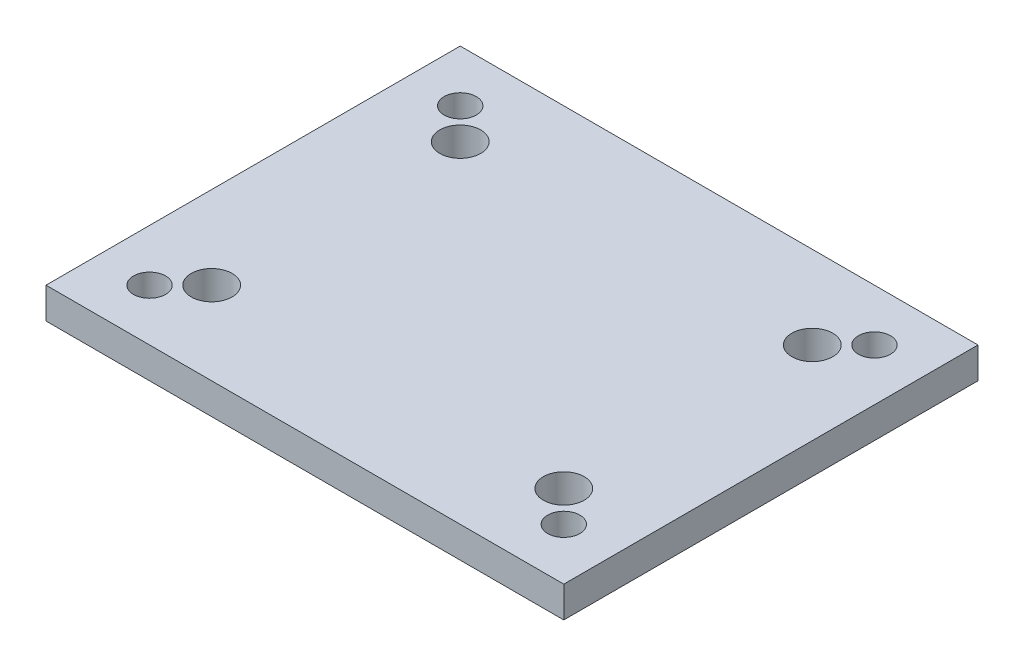
ISO-10303-21;
HEADER;
FILE_DESCRIPTION(('STEP AP214'),'2;1');
FILE_NAME('part.step','',(''),(''),'','','');
FILE_SCHEMA(('AUTOMOTIVE_DESIGN { 1 0 10303 214 1 1 1 1 }'));
ENDSEC;
DATA;
#1=APPLICATION_CONTEXT('core data for automotive mechanical design processes');
#2=APPLICATION_PROTOCOL_DEFINITION('international standard','automotive_design',2000,#1);
#3=PRODUCT_CONTEXT('',#1,'mechanical');
#4=PRODUCT('Part','Part','',(#3));
#5=PRODUCT_RELATED_PRODUCT_CATEGORY('part','',(#4));
#6=PRODUCT_DEFINITION_FORMATION('','',#4);
#7=PRODUCT_DEFINITION_CONTEXT('part definition',#1,'design');
#8=PRODUCT_DEFINITION('design','',#6,#7);
#9=PRODUCT_DEFINITION_SHAPE('','',#8);
#10=(LENGTH_UNIT() NAMED_UNIT(*) SI_UNIT(.MILLI.,.METRE.));
#11=(NAMED_UNIT(*) PLANE_ANGLE_UNIT() SI_UNIT($,.RADIAN.));
#12=(NAMED_UNIT(*) SI_UNIT($,.STERADIAN.) SOLID_ANGLE_UNIT());
#13=UNCERTAINTY_MEASURE_WITH_UNIT(LENGTH_MEASURE(1.E-05),#10,'distance_accuracy_value','');
#14=(GEOMETRIC_REPRESENTATION_CONTEXT(3) GLOBAL_UNCERTAINTY_ASSIGNED_CONTEXT((#13)) GLOBAL_UNIT_ASSIGNED_CONTEXT((#10,
#11,#12)) REPRESENTATION_CONTEXT('',''));
#15=CARTESIAN_POINT('',(0.,0.,0.));
#16=DIRECTION('',(0.,0.,1.));
#17=DIRECTION('',(1.,0.,0.));
#18=AXIS2_PLACEMENT_3D('',#15,#16,#17);
#19=CARTESIAN_POINT('',(0.,3.,0.));
#20=DIRECTION('',(0.,-1.,0.));
#21=DIRECTION('',(0.,0.,-1.));
#22=AXIS2_PLACEMENT_3D('',#19,#20,#21);
#23=PLANE('',#22);
#24=DIRECTION('',(0.,0.,1.));
#25=VECTOR('',#24,1.);
#26=CARTESIAN_POINT('',(0.,3.,0.));
#27=LINE('',#26,#25);
#28=CARTESIAN_POINT('',(0.,3.,-40.));
#29=VERTEX_POINT('',#28);
#30=CARTESIAN_POINT('',(0.,3.,0.));
#31=VERTEX_POINT('',#30);
#32=EDGE_CURVE('E96',#29,#31,#27,.T.);
#33=ORIENTED_EDGE('',*,*,#32,.T.);
#34=DIRECTION('',(1.,0.,0.));
#35=VECTOR('',#34,1.);
#36=CARTESIAN_POINT('',(0.,3.,0.));
#37=LINE('',#36,#35);
#38=CARTESIAN_POINT('',(50.,3.,0.));
#39=VERTEX_POINT('',#38);
#40=EDGE_CURVE('E91',#31,#39,#37,.T.);
#41=ORIENTED_EDGE('',*,*,#40,.T.);
#42=DIRECTION('',(0.,0.,-1.));
#43=VECTOR('',#42,1.);
#44=CARTESIAN_POINT('',(50.,3.,0.));
#45=LINE('',#44,#43);
#46=CARTESIAN_POINT('',(50.,3.,-40.));
#47=VERTEX_POINT('',#46);
#48=EDGE_CURVE('E94',#39,#47,#45,.T.);
#49=ORIENTED_EDGE('',*,*,#48,.T.);
#50=DIRECTION('',(-1.,0.,0.));
#51=VECTOR('',#50,1.);
#52=CARTESIAN_POINT('',(0.,3.,-40.));
#53=LINE('',#52,#51);
#54=EDGE_CURVE('E61',#47,#29,#53,.T.);
#55=ORIENTED_EDGE('',*,*,#54,.T.);
#56=EDGE_LOOP('',(#33,#41,#49,#55));
#57=FACE_BOUND('',#56,.T.);
#58=CARTESIAN_POINT('',(5.,3.,-35.));
#59=DIRECTION('',(0.,1.,0.));
#60=DIRECTION('',(0.,0.,1.));
#61=AXIS2_PLACEMENT_3D('',#58,#59,#60);
#62=CIRCLE('',#61,1.55);
#63=CARTESIAN_POINT('',(5.,3.,-33.45));
#64=VERTEX_POINT('',#63);
#65=EDGE_CURVE('E116',#64,#64,#62,.T.);
#66=ORIENTED_EDGE('',*,*,#65,.F.);
#67=EDGE_LOOP('',(#66));
#68=FACE_BOUND('',#67,.T.);
#69=CARTESIAN_POINT('',(45.,3.,-35.));
#70=DIRECTION('',(0.,1.,0.));
#71=DIRECTION('',(0.,0.,1.));
#72=AXIS2_PLACEMENT_3D('',#69,#70,#71);
#73=CIRCLE('',#72,1.55);
#74=CARTESIAN_POINT('',(45.,3.,-33.45));
#75=VERTEX_POINT('',#74);
#76=EDGE_CURVE('E138',#75,#75,#73,.T.);
#77=ORIENTED_EDGE('',*,*,#76,.F.);
#78=EDGE_LOOP('',(#77));
#79=FACE_BOUND('',#78,.T.);
#80=CARTESIAN_POINT('',(5.,3.,-5.));
#81=DIRECTION('',(0.,1.,0.));
#82=DIRECTION('',(0.,0.,1.));
#83=AXIS2_PLACEMENT_3D('',#80,#81,#82);
#84=CIRCLE('',#83,1.55);
#85=CARTESIAN_POINT('',(5.,3.,-3.45));
#86=VERTEX_POINT('',#85);
#87=EDGE_CURVE('E146',#86,#86,#84,.T.);
#88=ORIENTED_EDGE('',*,*,#87,.F.);
#89=EDGE_LOOP('',(#88));
#90=FACE_BOUND('',#89,.T.);
#91=CARTESIAN_POINT('',(45.,3.,-5.));
#92=DIRECTION('',(0.,1.,0.));
#93=DIRECTION('',(0.,0.,1.));
#94=AXIS2_PLACEMENT_3D('',#91,#92,#93);
#95=CIRCLE('',#94,1.55);
#96=CARTESIAN_POINT('',(45.,3.,-3.45));
#97=VERTEX_POINT('',#96);
#98=EDGE_CURVE('E154',#97,#97,#95,.T.);
#99=ORIENTED_EDGE('',*,*,#98,.F.);
#100=EDGE_LOOP('',(#99));
#101=FACE_BOUND('',#100,.T.);
#102=CARTESIAN_POINT('',(42.,3.,-32.));
#103=DIRECTION('',(0.,1.,0.));
#104=DIRECTION('',(0.,0.,1.));
#105=AXIS2_PLACEMENT_3D('',#102,#103,#104);
#106=CIRCLE('',#105,1.975);
#107=CARTESIAN_POINT('',(42.,3.,-30.025));
#108=VERTEX_POINT('',#107);
#109=EDGE_CURVE('E162',#108,#108,#106,.T.);
#110=ORIENTED_EDGE('',*,*,#109,.F.);
#111=EDGE_LOOP('',(#110));
#112=FACE_BOUND('',#111,.T.);
#113=CARTESIAN_POINT('',(8.,3.,-32.));
#114=DIRECTION('',(0.,1.,0.));
#115=DIRECTION('',(0.,0.,1.));
#116=AXIS2_PLACEMENT_3D('',#113,#114,#115);
#117=CIRCLE('',#116,1.975);
#118=CARTESIAN_POINT('',(8.,3.,-30.025));
#119=VERTEX_POINT('',#118);
#120=EDGE_CURVE('E170',#119,#119,#117,.T.);
#121=ORIENTED_EDGE('',*,*,#120,.F.);
#122=EDGE_LOOP('',(#121));
#123=FACE_BOUND('',#122,.T.);
#124=CARTESIAN_POINT('',(8.,3.,-8.));
#125=DIRECTION('',(0.,1.,0.));
#126=DIRECTION('',(0.,0.,1.));
#127=AXIS2_PLACEMENT_3D('',#124,#125,#126);
#128=CIRCLE('',#127,1.975);
#129=CARTESIAN_POINT('',(8.,3.,-6.025));
#130=VERTEX_POINT('',#129);
#131=EDGE_CURVE('E178',#130,#130,#128,.T.);
#132=ORIENTED_EDGE('',*,*,#131,.F.);
#133=EDGE_LOOP('',(#132));
#134=FACE_BOUND('',#133,.T.);
#135=CARTESIAN_POINT('',(42.,3.,-8.));
#136=DIRECTION('',(0.,1.,0.));
#137=DIRECTION('',(0.,0.,1.));
#138=AXIS2_PLACEMENT_3D('',#135,#136,#137);
#139=CIRCLE('',#138,1.975);
#140=CARTESIAN_POINT('',(42.,3.,-6.025));
#141=VERTEX_POINT('',#140);
#142=EDGE_CURVE('E186',#141,#141,#139,.T.);
#143=ORIENTED_EDGE('',*,*,#142,.F.);
#144=EDGE_LOOP('',(#143));
#145=FACE_BOUND('',#144,.T.);
#146=ADVANCED_FACE('F43',(#57,#68,#79,#90,#101,#112,#123,#134,#145),#23,.F.);
#147=CARTESIAN_POINT('',(0.,0.,0.));
#148=DIRECTION('',(0.,-1.,0.));
#149=DIRECTION('',(0.,0.,-1.));
#150=AXIS2_PLACEMENT_3D('',#147,#148,#149);
#151=PLANE('',#150);
#152=CARTESIAN_POINT('',(8.,0.,-8.));
#153=DIRECTION('',(0.,1.,0.));
#154=DIRECTION('',(0.,0.,1.));
#155=AXIS2_PLACEMENT_3D('',#152,#153,#154);
#156=CIRCLE('',#155,1.975);
#157=CARTESIAN_POINT('',(8.,0.,-6.025));
#158=VERTEX_POINT('',#157);
#159=EDGE_CURVE('E182',#158,#158,#156,.T.);
#160=ORIENTED_EDGE('',*,*,#159,.T.);
#161=EDGE_LOOP('',(#160));
#162=FACE_BOUND('',#161,.T.);
#163=CARTESIAN_POINT('',(42.,0.,-32.));
#164=DIRECTION('',(0.,1.,0.));
#165=DIRECTION('',(0.,0.,1.));
#166=AXIS2_PLACEMENT_3D('',#163,#164,#165);
#167=CIRCLE('',#166,1.975);
#168=CARTESIAN_POINT('',(42.,0.,-30.025));
#169=VERTEX_POINT('',#168);
#170=EDGE_CURVE('E166',#169,#169,#167,.T.);
#171=ORIENTED_EDGE('',*,*,#170,.T.);
#172=EDGE_LOOP('',(#171));
#173=FACE_BOUND('',#172,.T.);
#174=CARTESIAN_POINT('',(5.,0.,-5.));
#175=DIRECTION('',(0.,1.,0.));
#176=DIRECTION('',(0.,0.,1.));
#177=AXIS2_PLACEMENT_3D('',#174,#175,#176);
#178=CIRCLE('',#177,1.55);
#179=CARTESIAN_POINT('',(5.,0.,-3.45));
#180=VERTEX_POINT('',#179);
#181=EDGE_CURVE('E150',#180,#180,#178,.T.);
#182=ORIENTED_EDGE('',*,*,#181,.T.);
#183=EDGE_LOOP('',(#182));
#184=FACE_BOUND('',#183,.T.);
#185=CARTESIAN_POINT('',(5.,0.,-35.));
#186=DIRECTION('',(0.,1.,0.));
#187=DIRECTION('',(0.,0.,1.));
#188=AXIS2_PLACEMENT_3D('',#185,#186,#187);
#189=CIRCLE('',#188,1.55);
#190=CARTESIAN_POINT('',(5.,0.,-33.45));
#191=VERTEX_POINT('',#190);
#192=EDGE_CURVE('E134',#191,#191,#189,.T.);
#193=ORIENTED_EDGE('',*,*,#192,.T.);
#194=EDGE_LOOP('',(#193));
#195=FACE_BOUND('',#194,.T.);
#196=DIRECTION('',(0.,0.,1.));
#197=VECTOR('',#196,1.);
#198=CARTESIAN_POINT('',(0.,0.,0.));
#199=LINE('',#198,#197);
#200=CARTESIAN_POINT('',(0.,0.,-40.));
#201=VERTEX_POINT('',#200);
#202=CARTESIAN_POINT('',(0.,0.,0.));
#203=VERTEX_POINT('',#202);
#204=EDGE_CURVE('E112',#201,#203,#199,.T.);
#205=ORIENTED_EDGE('',*,*,#204,.F.);
#206=DIRECTION('',(-1.,0.,0.));
#207=VECTOR('',#206,1.);
#208=CARTESIAN_POINT('',(0.,0.,-40.));
#209=LINE('',#208,#207);
#210=CARTESIAN_POINT('',(50.,0.,-40.));
#211=VERTEX_POINT('',#210);
#212=EDGE_CURVE('E84',#211,#201,#209,.T.);
#213=ORIENTED_EDGE('',*,*,#212,.F.);
#214=DIRECTION('',(0.,0.,-1.));
#215=VECTOR('',#214,1.);
#216=CARTESIAN_POINT('',(50.,0.,0.));
#217=LINE('',#216,#215);
#218=CARTESIAN_POINT('',(50.,0.,0.));
#219=VERTEX_POINT('',#218);
#220=EDGE_CURVE('E78',#219,#211,#217,.T.);
#221=ORIENTED_EDGE('',*,*,#220,.F.);
#222=DIRECTION('',(1.,0.,0.));
#223=VECTOR('',#222,1.);
#224=CARTESIAN_POINT('',(0.,0.,0.));
#225=LINE('',#224,#223);
#226=EDGE_CURVE('E101',#203,#219,#225,.T.);
#227=ORIENTED_EDGE('',*,*,#226,.F.);
#228=EDGE_LOOP('',(#205,#213,#221,#227));
#229=FACE_BOUND('',#228,.T.);
#230=CARTESIAN_POINT('',(45.,0.,-35.));
#231=DIRECTION('',(0.,1.,0.));
#232=DIRECTION('',(0.,0.,1.));
#233=AXIS2_PLACEMENT_3D('',#230,#231,#232);
#234=CIRCLE('',#233,1.55);
#235=CARTESIAN_POINT('',(45.,0.,-33.45));
#236=VERTEX_POINT('',#235);
#237=EDGE_CURVE('E142',#236,#236,#234,.T.);
#238=ORIENTED_EDGE('',*,*,#237,.T.);
#239=EDGE_LOOP('',(#238));
#240=FACE_BOUND('',#239,.T.);
#241=CARTESIAN_POINT('',(45.,0.,-5.));
#242=DIRECTION('',(0.,1.,0.));
#243=DIRECTION('',(0.,0.,1.));
#244=AXIS2_PLACEMENT_3D('',#241,#242,#243);
#245=CIRCLE('',#244,1.55);
#246=CARTESIAN_POINT('',(45.,0.,-3.45));
#247=VERTEX_POINT('',#246);
#248=EDGE_CURVE('E158',#247,#247,#245,.T.);
#249=ORIENTED_EDGE('',*,*,#248,.T.);
#250=EDGE_LOOP('',(#249));
#251=FACE_BOUND('',#250,.T.);
#252=CARTESIAN_POINT('',(8.,0.,-32.));
#253=DIRECTION('',(0.,1.,0.));
#254=DIRECTION('',(0.,0.,1.));
#255=AXIS2_PLACEMENT_3D('',#252,#253,#254);
#256=CIRCLE('',#255,1.975);
#257=CARTESIAN_POINT('',(8.,0.,-30.025));
#258=VERTEX_POINT('',#257);
#259=EDGE_CURVE('E174',#258,#258,#256,.T.);
#260=ORIENTED_EDGE('',*,*,#259,.T.);
#261=EDGE_LOOP('',(#260));
#262=FACE_BOUND('',#261,.T.);
#263=CARTESIAN_POINT('',(42.,0.,-8.));
#264=DIRECTION('',(0.,1.,0.));
#265=DIRECTION('',(0.,0.,1.));
#266=AXIS2_PLACEMENT_3D('',#263,#264,#265);
#267=CIRCLE('',#266,1.975);
#268=CARTESIAN_POINT('',(42.,0.,-6.025));
#269=VERTEX_POINT('',#268);
#270=EDGE_CURVE('E190',#269,#269,#267,.T.);
#271=ORIENTED_EDGE('',*,*,#270,.T.);
#272=EDGE_LOOP('',(#271));
#273=FACE_BOUND('',#272,.T.);
#274=ADVANCED_FACE('F129',(#162,#173,#184,#195,#229,#240,#251,#262,#273),#151,.T.);
#275=CARTESIAN_POINT('',(0.,3.,0.));
#276=DIRECTION('',(1.,0.,0.));
#277=DIRECTION('',(0.,0.,-1.));
#278=AXIS2_PLACEMENT_3D('',#275,#276,#277);
#279=PLANE('',#278);
#280=ORIENTED_EDGE('',*,*,#204,.T.);
#281=DIRECTION('',(0.,-1.,0.));
#282=VECTOR('',#281,1.);
#283=CARTESIAN_POINT('',(0.,3.,0.));
#284=LINE('',#283,#282);
#285=EDGE_CURVE('E11',#31,#203,#284,.T.);
#286=ORIENTED_EDGE('',*,*,#285,.F.);
#287=ORIENTED_EDGE('',*,*,#32,.F.);
#288=DIRECTION('',(0.,-1.,0.));
#289=VECTOR('',#288,1.);
#290=CARTESIAN_POINT('',(0.,3.,-40.));
#291=LINE('',#290,#289);
#292=EDGE_CURVE('E108',#29,#201,#291,.T.);
#293=ORIENTED_EDGE('',*,*,#292,.T.);
#294=EDGE_LOOP('',(#280,#286,#287,#293));
#295=FACE_BOUND('',#294,.T.);
#296=ADVANCED_FACE('F45',(#295),#279,.F.);
#297=CARTESIAN_POINT('',(0.,3.,0.));
#298=DIRECTION('',(0.,0.,-1.));
#299=DIRECTION('',(-1.,0.,0.));
#300=AXIS2_PLACEMENT_3D('',#297,#298,#299);
#301=PLANE('',#300);
#302=ORIENTED_EDGE('',*,*,#226,.T.);
#303=DIRECTION('',(0.,-1.,0.));
#304=VECTOR('',#303,1.);
#305=CARTESIAN_POINT('',(50.,3.,0.));
#306=LINE('',#305,#304);
#307=EDGE_CURVE('E53',#39,#219,#306,.T.);
#308=ORIENTED_EDGE('',*,*,#307,.F.);
#309=ORIENTED_EDGE('',*,*,#40,.F.);
#310=ORIENTED_EDGE('',*,*,#285,.T.);
#311=EDGE_LOOP('',(#302,#308,#309,#310));
#312=FACE_BOUND('',#311,.T.);
#313=ADVANCED_FACE('F100',(#312),#301,.F.);
#314=CARTESIAN_POINT('',(50.,3.,0.));
#315=DIRECTION('',(-1.,0.,0.));
#316=DIRECTION('',(0.,0.,1.));
#317=AXIS2_PLACEMENT_3D('',#314,#315,#316);
#318=PLANE('',#317);
#319=ORIENTED_EDGE('',*,*,#220,.T.);
#320=DIRECTION('',(0.,-1.,0.));
#321=VECTOR('',#320,1.);
#322=CARTESIAN_POINT('',(50.,3.,-40.));
#323=LINE('',#322,#321);
#324=EDGE_CURVE('E103',#47,#211,#323,.T.);
#325=ORIENTED_EDGE('',*,*,#324,.F.);
#326=ORIENTED_EDGE('',*,*,#48,.F.);
#327=ORIENTED_EDGE('',*,*,#307,.T.);
#328=EDGE_LOOP('',(#319,#325,#326,#327));
#329=FACE_BOUND('',#328,.T.);
#330=ADVANCED_FACE('F104',(#329),#318,.F.);
#331=CARTESIAN_POINT('',(0.,3.,-40.));
#332=DIRECTION('',(0.,0.,1.));
#333=DIRECTION('',(1.,0.,0.));
#334=AXIS2_PLACEMENT_3D('',#331,#332,#333);
#335=PLANE('',#334);
#336=ORIENTED_EDGE('',*,*,#212,.T.);
#337=ORIENTED_EDGE('',*,*,#292,.F.);
#338=ORIENTED_EDGE('',*,*,#54,.F.);
#339=ORIENTED_EDGE('',*,*,#324,.T.);
#340=EDGE_LOOP('',(#336,#337,#338,#339));
#341=FACE_BOUND('',#340,.T.);
#342=ADVANCED_FACE('F126',(#341),#335,.F.);
#343=CARTESIAN_POINT('',(5.,3.,-35.));
#344=DIRECTION('',(0.,-1.,0.));
#345=DIRECTION('',(0.,0.,-1.));
#346=AXIS2_PLACEMENT_3D('',#343,#344,#345);
#347=CYLINDRICAL_SURFACE('',#346,1.55);
#348=ORIENTED_EDGE('',*,*,#65,.T.);
#349=EDGE_LOOP('',(#348));
#350=FACE_BOUND('',#349,.T.);
#351=ORIENTED_EDGE('',*,*,#192,.F.);
#352=EDGE_LOOP('',(#351));
#353=FACE_BOUND('',#352,.T.);
#354=ADVANCED_FACE('F209',(#350,#353),#347,.F.);
#355=CARTESIAN_POINT('',(45.,3.,-35.));
#356=DIRECTION('',(0.,-1.,0.));
#357=DIRECTION('',(0.,0.,-1.));
#358=AXIS2_PLACEMENT_3D('',#355,#356,#357);
#359=CYLINDRICAL_SURFACE('',#358,1.55);
#360=ORIENTED_EDGE('',*,*,#76,.T.);
#361=EDGE_LOOP('',(#360));
#362=FACE_BOUND('',#361,.T.);
#363=ORIENTED_EDGE('',*,*,#237,.F.);
#364=EDGE_LOOP('',(#363));
#365=FACE_BOUND('',#364,.T.);
#366=ADVANCED_FACE('F263',(#362,#365),#359,.F.);
#367=CARTESIAN_POINT('',(5.,3.,-5.));
#368=DIRECTION('',(0.,-1.,0.));
#369=DIRECTION('',(0.,0.,-1.));
#370=AXIS2_PLACEMENT_3D('',#367,#368,#369);
#371=CYLINDRICAL_SURFACE('',#370,1.55);
#372=ORIENTED_EDGE('',*,*,#87,.T.);
#373=EDGE_LOOP('',(#372));
#374=FACE_BOUND('',#373,.T.);
#375=ORIENTED_EDGE('',*,*,#181,.F.);
#376=EDGE_LOOP('',(#375));
#377=FACE_BOUND('',#376,.T.);
#378=ADVANCED_FACE('F272',(#374,#377),#371,.F.);
#379=CARTESIAN_POINT('',(45.,3.,-5.));
#380=DIRECTION('',(0.,-1.,0.));
#381=DIRECTION('',(0.,0.,-1.));
#382=AXIS2_PLACEMENT_3D('',#379,#380,#381);
#383=CYLINDRICAL_SURFACE('',#382,1.55);
#384=ORIENTED_EDGE('',*,*,#98,.T.);
#385=EDGE_LOOP('',(#384));
#386=FACE_BOUND('',#385,.T.);
#387=ORIENTED_EDGE('',*,*,#248,.F.);
#388=EDGE_LOOP('',(#387));
#389=FACE_BOUND('',#388,.T.);
#390=ADVANCED_FACE('F281',(#386,#389),#383,.F.);
#391=CARTESIAN_POINT('',(42.,3.,-32.));
#392=DIRECTION('',(0.,-1.,0.));
#393=DIRECTION('',(0.,0.,-1.));
#394=AXIS2_PLACEMENT_3D('',#391,#392,#393);
#395=CYLINDRICAL_SURFACE('',#394,1.975);
#396=ORIENTED_EDGE('',*,*,#109,.T.);
#397=EDGE_LOOP('',(#396));
#398=FACE_BOUND('',#397,.T.);
#399=ORIENTED_EDGE('',*,*,#170,.F.);
#400=EDGE_LOOP('',(#399));
#401=FACE_BOUND('',#400,.T.);
#402=ADVANCED_FACE('F291',(#398,#401),#395,.F.);
#403=CARTESIAN_POINT('',(8.,3.,-32.));
#404=DIRECTION('',(0.,-1.,0.));
#405=DIRECTION('',(0.,0.,-1.));
#406=AXIS2_PLACEMENT_3D('',#403,#404,#405);
#407=CYLINDRICAL_SURFACE('',#406,1.975);
#408=ORIENTED_EDGE('',*,*,#120,.T.);
#409=EDGE_LOOP('',(#408));
#410=FACE_BOUND('',#409,.T.);
#411=ORIENTED_EDGE('',*,*,#259,.F.);
#412=EDGE_LOOP('',(#411));
#413=FACE_BOUND('',#412,.T.);
#414=ADVANCED_FACE('F301',(#410,#413),#407,.F.);
#415=CARTESIAN_POINT('',(8.,3.,-8.));
#416=DIRECTION('',(0.,-1.,0.));
#417=DIRECTION('',(0.,0.,-1.));
#418=AXIS2_PLACEMENT_3D('',#415,#416,#417);
#419=CYLINDRICAL_SURFACE('',#418,1.975);
#420=ORIENTED_EDGE('',*,*,#131,.T.);
#421=EDGE_LOOP('',(#420));
#422=FACE_BOUND('',#421,.T.);
#423=ORIENTED_EDGE('',*,*,#159,.F.);
#424=EDGE_LOOP('',(#423));
#425=FACE_BOUND('',#424,.T.);
#426=ADVANCED_FACE('F311',(#422,#425),#419,.F.);
#427=CARTESIAN_POINT('',(42.,3.,-8.));
#428=DIRECTION('',(0.,-1.,0.));
#429=DIRECTION('',(0.,0.,-1.));
#430=AXIS2_PLACEMENT_3D('',#427,#428,#429);
#431=CYLINDRICAL_SURFACE('',#430,1.975);
#432=ORIENTED_EDGE('',*,*,#142,.T.);
#433=EDGE_LOOP('',(#432));
#434=FACE_BOUND('',#433,.T.);
#435=ORIENTED_EDGE('',*,*,#270,.F.);
#436=EDGE_LOOP('',(#435));
#437=FACE_BOUND('',#436,.T.);
#438=ADVANCED_FACE('F198',(#434,#437),#431,.F.);
#439=CLOSED_SHELL('',(#146,#274,#296,#313,#330,#342,#354,#366,#378,#390,#402,#414,#426,#438));
#440=MANIFOLD_SOLID_BREP('B2',#439);
#441=ADVANCED_BREP_SHAPE_REPRESENTATION('',(#18,#440),#14);
#442=SHAPE_DEFINITION_REPRESENTATION(#9,#441);
ENDSEC;
END-ISO-10303-21;
